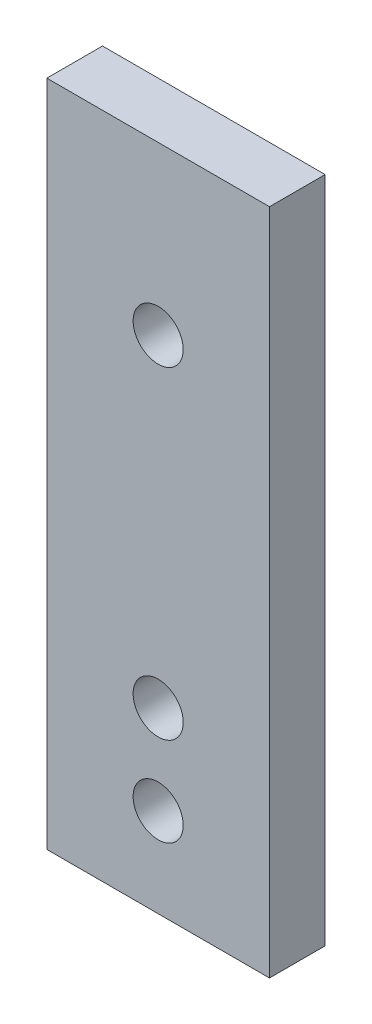
ISO-10303-21;
HEADER;
FILE_DESCRIPTION(('STEP AP214'),'2;1');
FILE_NAME('part.step','',(''),(''),'','','');
FILE_SCHEMA(('AUTOMOTIVE_DESIGN { 1 0 10303 214 1 1 1 1 }'));
ENDSEC;
DATA;
#1=APPLICATION_CONTEXT('core data for automotive mechanical design processes');
#2=APPLICATION_PROTOCOL_DEFINITION('international standard','automotive_design',2000,#1);
#3=PRODUCT_CONTEXT('',#1,'mechanical');
#4=PRODUCT('Part','Part','',(#3));
#5=PRODUCT_RELATED_PRODUCT_CATEGORY('part','',(#4));
#6=PRODUCT_DEFINITION_FORMATION('','',#4);
#7=PRODUCT_DEFINITION_CONTEXT('part definition',#1,'design');
#8=PRODUCT_DEFINITION('design','',#6,#7);
#9=PRODUCT_DEFINITION_SHAPE('','',#8);
#10=(LENGTH_UNIT() NAMED_UNIT(*) SI_UNIT(.MILLI.,.METRE.));
#11=(NAMED_UNIT(*) PLANE_ANGLE_UNIT() SI_UNIT($,.RADIAN.));
#12=(NAMED_UNIT(*) SI_UNIT($,.STERADIAN.) SOLID_ANGLE_UNIT());
#13=UNCERTAINTY_MEASURE_WITH_UNIT(LENGTH_MEASURE(1.E-05),#10,'distance_accuracy_value','');
#14=(GEOMETRIC_REPRESENTATION_CONTEXT(3) GLOBAL_UNCERTAINTY_ASSIGNED_CONTEXT((#13)) GLOBAL_UNIT_ASSIGNED_CONTEXT((#10,
#11,#12)) REPRESENTATION_CONTEXT('',''));
#15=CARTESIAN_POINT('',(0.,0.,0.));
#16=DIRECTION('',(0.,0.,1.));
#17=DIRECTION('',(1.,0.,0.));
#18=AXIS2_PLACEMENT_3D('',#15,#16,#17);
#19=CARTESIAN_POINT('',(0.,0.,5.));
#20=DIRECTION('',(0.,0.,-1.));
#21=DIRECTION('',(-1.,0.,0.));
#22=AXIS2_PLACEMENT_3D('',#19,#20,#21);
#23=PLANE('',#22);
#24=DIRECTION('',(0.,-1.,0.));
#25=VECTOR('',#24,1.);
#26=CARTESIAN_POINT('',(0.,0.,5.));
#27=LINE('',#26,#25);
#28=CARTESIAN_POINT('',(0.,60.,5.));
#29=VERTEX_POINT('',#28);
#30=CARTESIAN_POINT('',(0.,0.,5.));
#31=VERTEX_POINT('',#30);
#32=EDGE_CURVE('E85',#29,#31,#27,.T.);
#33=ORIENTED_EDGE('',*,*,#32,.T.);
#34=DIRECTION('',(1.,0.,0.));
#35=VECTOR('',#34,1.);
#36=CARTESIAN_POINT('',(0.,0.,5.));
#37=LINE('',#36,#35);
#38=CARTESIAN_POINT('',(20.,0.,5.));
#39=VERTEX_POINT('',#38);
#40=EDGE_CURVE('E80',#31,#39,#37,.T.);
#41=ORIENTED_EDGE('',*,*,#40,.T.);
#42=DIRECTION('',(0.,1.,0.));
#43=VECTOR('',#42,1.);
#44=CARTESIAN_POINT('',(20.,0.,5.));
#45=LINE('',#44,#43);
#46=CARTESIAN_POINT('',(20.,60.,5.));
#47=VERTEX_POINT('',#46);
#48=EDGE_CURVE('E83',#39,#47,#45,.T.);
#49=ORIENTED_EDGE('',*,*,#48,.T.);
#50=DIRECTION('',(-1.,0.,0.));
#51=VECTOR('',#50,1.);
#52=CARTESIAN_POINT('',(0.,60.,5.));
#53=LINE('',#52,#51);
#54=EDGE_CURVE('E50',#47,#29,#53,.T.);
#55=ORIENTED_EDGE('',*,*,#54,.T.);
#56=EDGE_LOOP('',(#33,#41,#49,#55));
#57=FACE_BOUND('',#56,.T.);
#58=CARTESIAN_POINT('',(9.99999999999999,45.,5.));
#59=DIRECTION('',(0.,0.,1.));
#60=DIRECTION('',(1.,0.,0.));
#61=AXIS2_PLACEMENT_3D('',#58,#59,#60);
#62=CIRCLE('',#61,2.25);
#63=CARTESIAN_POINT('',(12.25,45.,5.));
#64=VERTEX_POINT('',#63);
#65=EDGE_CURVE('E100',#64,#64,#62,.T.);
#66=ORIENTED_EDGE('',*,*,#65,.F.);
#67=EDGE_LOOP('',(#66));
#68=FACE_BOUND('',#67,.T.);
#69=CARTESIAN_POINT('',(10.,16.,5.));
#70=DIRECTION('',(0.,0.,1.));
#71=DIRECTION('',(1.,0.,0.));
#72=AXIS2_PLACEMENT_3D('',#69,#70,#71);
#73=CIRCLE('',#72,2.25);
#74=CARTESIAN_POINT('',(12.25,16.,5.));
#75=VERTEX_POINT('',#74);
#76=EDGE_CURVE('E115',#75,#75,#73,.T.);
#77=ORIENTED_EDGE('',*,*,#76,.F.);
#78=EDGE_LOOP('',(#77));
#79=FACE_BOUND('',#78,.T.);
#80=CARTESIAN_POINT('',(10.,8.,5.));
#81=DIRECTION('',(0.,0.,1.));
#82=DIRECTION('',(1.,0.,0.));
#83=AXIS2_PLACEMENT_3D('',#80,#81,#82);
#84=CIRCLE('',#83,2.25);
#85=CARTESIAN_POINT('',(12.25,8.,5.));
#86=VERTEX_POINT('',#85);
#87=EDGE_CURVE('E121',#86,#86,#84,.T.);
#88=ORIENTED_EDGE('',*,*,#87,.F.);
#89=EDGE_LOOP('',(#88));
#90=FACE_BOUND('',#89,.T.);
#91=ADVANCED_FACE('F33',(#57,#68,#79,#90),#23,.F.);
#92=CARTESIAN_POINT('',(0.,0.,0.));
#93=DIRECTION('',(0.,0.,-1.));
#94=DIRECTION('',(-1.,0.,0.));
#95=AXIS2_PLACEMENT_3D('',#92,#93,#94);
#96=PLANE('',#95);
#97=CARTESIAN_POINT('',(10.,16.,0.));
#98=DIRECTION('',(0.,0.,1.));
#99=DIRECTION('',(1.,0.,0.));
#100=AXIS2_PLACEMENT_3D('',#97,#98,#99);
#101=CIRCLE('',#100,2.25);
#102=CARTESIAN_POINT('',(12.25,16.,0.));
#103=VERTEX_POINT('',#102);
#104=EDGE_CURVE('E118',#103,#103,#101,.T.);
#105=ORIENTED_EDGE('',*,*,#104,.T.);
#106=EDGE_LOOP('',(#105));
#107=FACE_BOUND('',#106,.T.);
#108=DIRECTION('',(0.,-1.,0.));
#109=VECTOR('',#108,1.);
#110=CARTESIAN_POINT('',(0.,0.,0.));
#111=LINE('',#110,#109);
#112=CARTESIAN_POINT('',(0.,60.,0.));
#113=VERTEX_POINT('',#112);
#114=CARTESIAN_POINT('',(0.,0.,0.));
#115=VERTEX_POINT('',#114);
#116=EDGE_CURVE('E97',#113,#115,#111,.T.);
#117=ORIENTED_EDGE('',*,*,#116,.F.);
#118=DIRECTION('',(-1.,0.,0.));
#119=VECTOR('',#118,1.);
#120=CARTESIAN_POINT('',(0.,60.,0.));
#121=LINE('',#120,#119);
#122=CARTESIAN_POINT('',(20.,60.,0.));
#123=VERTEX_POINT('',#122);
#124=EDGE_CURVE('E73',#123,#113,#121,.T.);
#125=ORIENTED_EDGE('',*,*,#124,.F.);
#126=DIRECTION('',(0.,1.,0.));
#127=VECTOR('',#126,1.);
#128=CARTESIAN_POINT('',(20.,0.,0.));
#129=LINE('',#128,#127);
#130=CARTESIAN_POINT('',(20.,0.,0.));
#131=VERTEX_POINT('',#130);
#132=EDGE_CURVE('E67',#131,#123,#129,.T.);
#133=ORIENTED_EDGE('',*,*,#132,.F.);
#134=DIRECTION('',(1.,0.,0.));
#135=VECTOR('',#134,1.);
#136=CARTESIAN_POINT('',(0.,0.,0.));
#137=LINE('',#136,#135);
#138=EDGE_CURVE('E89',#115,#131,#137,.T.);
#139=ORIENTED_EDGE('',*,*,#138,.F.);
#140=EDGE_LOOP('',(#117,#125,#133,#139));
#141=FACE_BOUND('',#140,.T.);
#142=CARTESIAN_POINT('',(9.99999999999999,45.,0.));
#143=DIRECTION('',(0.,0.,1.));
#144=DIRECTION('',(1.,0.,0.));
#145=AXIS2_PLACEMENT_3D('',#142,#143,#144);
#146=CIRCLE('',#145,2.25);
#147=CARTESIAN_POINT('',(12.25,45.,0.));
#148=VERTEX_POINT('',#147);
#149=EDGE_CURVE('E112',#148,#148,#146,.T.);
#150=ORIENTED_EDGE('',*,*,#149,.T.);
#151=EDGE_LOOP('',(#150));
#152=FACE_BOUND('',#151,.T.);
#153=CARTESIAN_POINT('',(10.,8.,0.));
#154=DIRECTION('',(0.,0.,1.));
#155=DIRECTION('',(1.,0.,0.));
#156=AXIS2_PLACEMENT_3D('',#153,#154,#155);
#157=CIRCLE('',#156,2.25);
#158=CARTESIAN_POINT('',(12.25,8.,0.));
#159=VERTEX_POINT('',#158);
#160=EDGE_CURVE('E124',#159,#159,#157,.T.);
#161=ORIENTED_EDGE('',*,*,#160,.T.);
#162=EDGE_LOOP('',(#161));
#163=FACE_BOUND('',#162,.T.);
#164=ADVANCED_FACE('F108',(#107,#141,#152,#163),#96,.T.);
#165=CARTESIAN_POINT('',(0.,0.,5.));
#166=DIRECTION('',(1.,0.,0.));
#167=DIRECTION('',(0.,0.,-1.));
#168=AXIS2_PLACEMENT_3D('',#165,#166,#167);
#169=PLANE('',#168);
#170=ORIENTED_EDGE('',*,*,#116,.T.);
#171=DIRECTION('',(0.,0.,-1.));
#172=VECTOR('',#171,1.);
#173=CARTESIAN_POINT('',(0.,0.,5.));
#174=LINE('',#173,#172);
#175=EDGE_CURVE('E11',#31,#115,#174,.T.);
#176=ORIENTED_EDGE('',*,*,#175,.F.);
#177=ORIENTED_EDGE('',*,*,#32,.F.);
#178=DIRECTION('',(0.,0.,-1.));
#179=VECTOR('',#178,1.);
#180=CARTESIAN_POINT('',(0.,60.,5.));
#181=LINE('',#180,#179);
#182=EDGE_CURVE('E93',#29,#113,#181,.T.);
#183=ORIENTED_EDGE('',*,*,#182,.T.);
#184=EDGE_LOOP('',(#170,#176,#177,#183));
#185=FACE_BOUND('',#184,.T.);
#186=ADVANCED_FACE('F35',(#185),#169,.F.);
#187=CARTESIAN_POINT('',(0.,0.,5.));
#188=DIRECTION('',(0.,1.,0.));
#189=DIRECTION('',(0.,0.,1.));
#190=AXIS2_PLACEMENT_3D('',#187,#188,#189);
#191=PLANE('',#190);
#192=ORIENTED_EDGE('',*,*,#138,.T.);
#193=DIRECTION('',(0.,0.,-1.));
#194=VECTOR('',#193,1.);
#195=CARTESIAN_POINT('',(20.,0.,5.));
#196=LINE('',#195,#194);
#197=EDGE_CURVE('E42',#39,#131,#196,.T.);
#198=ORIENTED_EDGE('',*,*,#197,.F.);
#199=ORIENTED_EDGE('',*,*,#40,.F.);
#200=ORIENTED_EDGE('',*,*,#175,.T.);
#201=EDGE_LOOP('',(#192,#198,#199,#200));
#202=FACE_BOUND('',#201,.T.);
#203=ADVANCED_FACE('F88',(#202),#191,.F.);
#204=CARTESIAN_POINT('',(20.,0.,5.));
#205=DIRECTION('',(-1.,0.,0.));
#206=DIRECTION('',(0.,0.,1.));
#207=AXIS2_PLACEMENT_3D('',#204,#205,#206);
#208=PLANE('',#207);
#209=ORIENTED_EDGE('',*,*,#132,.T.);
#210=DIRECTION('',(0.,0.,-1.));
#211=VECTOR('',#210,1.);
#212=CARTESIAN_POINT('',(20.,60.,5.));
#213=LINE('',#212,#211);
#214=EDGE_CURVE('E90',#47,#123,#213,.T.);
#215=ORIENTED_EDGE('',*,*,#214,.F.);
#216=ORIENTED_EDGE('',*,*,#48,.F.);
#217=ORIENTED_EDGE('',*,*,#197,.T.);
#218=EDGE_LOOP('',(#209,#215,#216,#217));
#219=FACE_BOUND('',#218,.T.);
#220=ADVANCED_FACE('F91',(#219),#208,.F.);
#221=CARTESIAN_POINT('',(0.,60.,5.));
#222=DIRECTION('',(0.,-1.,0.));
#223=DIRECTION('',(0.,0.,-1.));
#224=AXIS2_PLACEMENT_3D('',#221,#222,#223);
#225=PLANE('',#224);
#226=ORIENTED_EDGE('',*,*,#124,.T.);
#227=ORIENTED_EDGE('',*,*,#182,.F.);
#228=ORIENTED_EDGE('',*,*,#54,.F.);
#229=ORIENTED_EDGE('',*,*,#214,.T.);
#230=EDGE_LOOP('',(#226,#227,#228,#229));
#231=FACE_BOUND('',#230,.T.);
#232=ADVANCED_FACE('F105',(#231),#225,.F.);
#233=CARTESIAN_POINT('',(9.99999999999999,45.,5.));
#234=DIRECTION('',(0.,0.,-1.));
#235=DIRECTION('',(-1.,0.,0.));
#236=AXIS2_PLACEMENT_3D('',#233,#234,#235);
#237=CYLINDRICAL_SURFACE('',#236,2.25);
#238=ORIENTED_EDGE('',*,*,#65,.T.);
#239=EDGE_LOOP('',(#238));
#240=FACE_BOUND('',#239,.T.);
#241=ORIENTED_EDGE('',*,*,#149,.F.);
#242=EDGE_LOOP('',(#241));
#243=FACE_BOUND('',#242,.T.);
#244=ADVANCED_FACE('F141',(#240,#243),#237,.F.);
#245=CARTESIAN_POINT('',(10.,16.,5.));
#246=DIRECTION('',(0.,0.,-1.));
#247=DIRECTION('',(-1.,0.,0.));
#248=AXIS2_PLACEMENT_3D('',#245,#246,#247);
#249=CYLINDRICAL_SURFACE('',#248,2.25);
#250=ORIENTED_EDGE('',*,*,#76,.T.);
#251=EDGE_LOOP('',(#250));
#252=FACE_BOUND('',#251,.T.);
#253=ORIENTED_EDGE('',*,*,#104,.F.);
#254=EDGE_LOOP('',(#253));
#255=FACE_BOUND('',#254,.T.);
#256=ADVANCED_FACE('F187',(#252,#255),#249,.F.);
#257=CARTESIAN_POINT('',(10.,8.,5.));
#258=DIRECTION('',(0.,0.,-1.));
#259=DIRECTION('',(-1.,0.,0.));
#260=AXIS2_PLACEMENT_3D('',#257,#258,#259);
#261=CYLINDRICAL_SURFACE('',#260,2.25);
#262=ORIENTED_EDGE('',*,*,#87,.T.);
#263=EDGE_LOOP('',(#262));
#264=FACE_BOUND('',#263,.T.);
#265=ORIENTED_EDGE('',*,*,#160,.F.);
#266=EDGE_LOOP('',(#265));
#267=FACE_BOUND('',#266,.T.);
#268=ADVANCED_FACE('F130',(#264,#267),#261,.F.);
#269=CLOSED_SHELL('',(#91,#164,#186,#203,#220,#232,#244,#256,#268));
#270=MANIFOLD_SOLID_BREP('B2',#269);
#271=ADVANCED_BREP_SHAPE_REPRESENTATION('',(#18,#270),#14);
#272=SHAPE_DEFINITION_REPRESENTATION(#9,#271);
ENDSEC;
END-ISO-10303-21;
